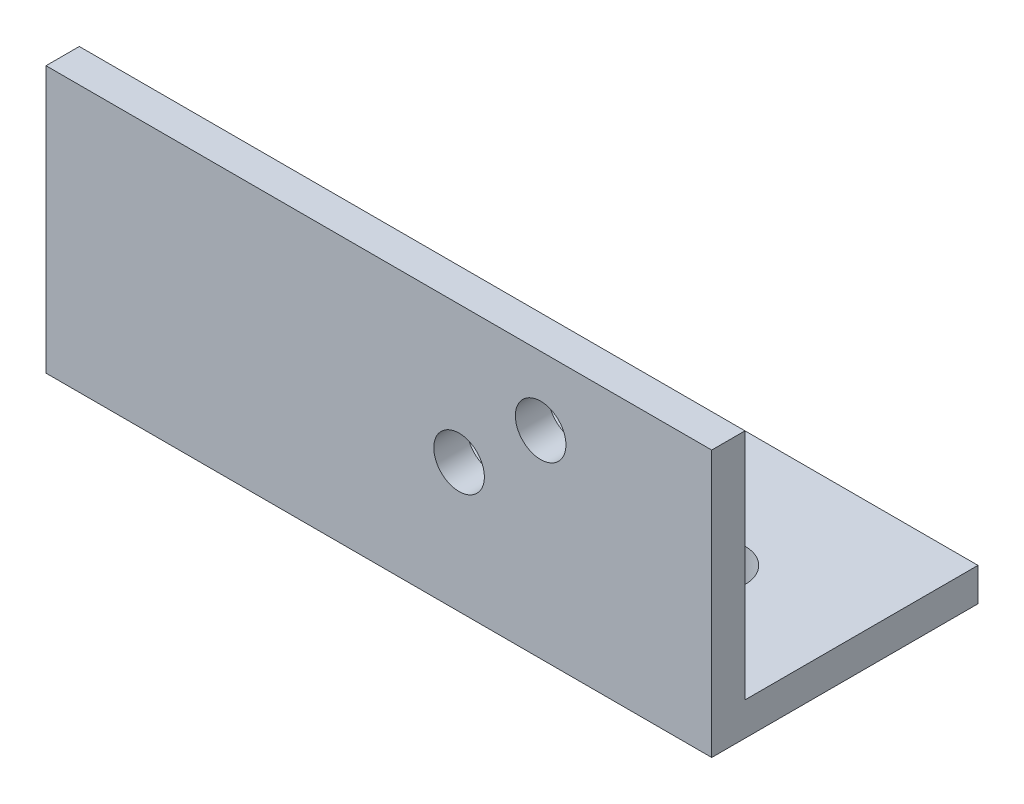
ISO-10303-21;
HEADER;
FILE_DESCRIPTION(('STEP AP214'),'2;1');
FILE_NAME('part.step','',(''),(''),'','','');
FILE_SCHEMA(('AUTOMOTIVE_DESIGN { 1 0 10303 214 1 1 1 1 }'));
ENDSEC;
DATA;
#1=APPLICATION_CONTEXT('core data for automotive mechanical design processes');
#2=APPLICATION_PROTOCOL_DEFINITION('international standard','automotive_design',2000,#1);
#3=PRODUCT_CONTEXT('',#1,'mechanical');
#4=PRODUCT('Part','Part','',(#3));
#5=PRODUCT_RELATED_PRODUCT_CATEGORY('part','',(#4));
#6=PRODUCT_DEFINITION_FORMATION('','',#4);
#7=PRODUCT_DEFINITION_CONTEXT('part definition',#1,'design');
#8=PRODUCT_DEFINITION('design','',#6,#7);
#9=PRODUCT_DEFINITION_SHAPE('','',#8);
#10=(LENGTH_UNIT() NAMED_UNIT(*) SI_UNIT(.MILLI.,.METRE.));
#11=(NAMED_UNIT(*) PLANE_ANGLE_UNIT() SI_UNIT($,.RADIAN.));
#12=(NAMED_UNIT(*) SI_UNIT($,.STERADIAN.) SOLID_ANGLE_UNIT());
#13=UNCERTAINTY_MEASURE_WITH_UNIT(LENGTH_MEASURE(1.E-05),#10,'distance_accuracy_value','');
#14=(GEOMETRIC_REPRESENTATION_CONTEXT(3) GLOBAL_UNCERTAINTY_ASSIGNED_CONTEXT((#13)) GLOBAL_UNIT_ASSIGNED_CONTEXT((#10,
#11,#12)) REPRESENTATION_CONTEXT('',''));
#15=CARTESIAN_POINT('',(0.,0.,0.));
#16=DIRECTION('',(0.,0.,1.));
#17=DIRECTION('',(1.,0.,0.));
#18=AXIS2_PLACEMENT_3D('',#15,#16,#17);
#19=CARTESIAN_POINT('',(0.,3.175,0.));
#20=DIRECTION('',(1.,0.,0.));
#21=DIRECTION('',(0.,0.,1.));
#22=AXIS2_PLACEMENT_3D('',#19,#20,#21);
#23=PLANE('',#22);
#24=DIRECTION('',(0.,0.,-1.));
#25=VECTOR('',#24,1.);
#26=CARTESIAN_POINT('',(0.,0.,0.));
#27=LINE('',#26,#25);
#28=CARTESIAN_POINT('',(0.,0.,0.));
#29=VERTEX_POINT('',#28);
#30=CARTESIAN_POINT('',(0.,0.,-25.4));
#31=VERTEX_POINT('',#30);
#32=EDGE_CURVE('E87',#29,#31,#27,.T.);
#33=ORIENTED_EDGE('',*,*,#32,.F.);
#34=DIRECTION('',(0.,-1.,0.));
#35=VECTOR('',#34,1.);
#36=CARTESIAN_POINT('',(0.,3.175,0.));
#37=LINE('',#36,#35);
#38=CARTESIAN_POINT('',(0.,25.4,0.));
#39=VERTEX_POINT('',#38);
#40=EDGE_CURVE('E96',#39,#29,#37,.T.);
#41=ORIENTED_EDGE('',*,*,#40,.F.);
#42=DIRECTION('',(0.,0.,-1.));
#43=VECTOR('',#42,1.);
#44=CARTESIAN_POINT('',(0.,25.4,0.));
#45=LINE('',#44,#43);
#46=CARTESIAN_POINT('',(0.,25.4,-3.175));
#47=VERTEX_POINT('',#46);
#48=EDGE_CURVE('E142',#39,#47,#45,.T.);
#49=ORIENTED_EDGE('',*,*,#48,.T.);
#50=DIRECTION('',(0.,-1.,0.));
#51=VECTOR('',#50,1.);
#52=CARTESIAN_POINT('',(0.,25.4,-3.175));
#53=LINE('',#52,#51);
#54=CARTESIAN_POINT('',(0.,3.175,-3.175));
#55=VERTEX_POINT('',#54);
#56=EDGE_CURVE('E108',#47,#55,#53,.T.);
#57=ORIENTED_EDGE('',*,*,#56,.T.);
#58=DIRECTION('',(0.,0.,-1.));
#59=VECTOR('',#58,1.);
#60=CARTESIAN_POINT('',(0.,3.175,0.));
#61=LINE('',#60,#59);
#62=CARTESIAN_POINT('',(0.,3.175,-25.4));
#63=VERTEX_POINT('',#62);
#64=EDGE_CURVE('E92',#55,#63,#61,.T.);
#65=ORIENTED_EDGE('',*,*,#64,.T.);
#66=DIRECTION('',(0.,-1.,0.));
#67=VECTOR('',#66,1.);
#68=CARTESIAN_POINT('',(0.,3.175,-25.4));
#69=LINE('',#68,#67);
#70=EDGE_CURVE('E11',#63,#31,#69,.T.);
#71=ORIENTED_EDGE('',*,*,#70,.T.);
#72=EDGE_LOOP('',(#33,#41,#49,#57,#65,#71));
#73=FACE_BOUND('',#72,.T.);
#74=ADVANCED_FACE('F41',(#73),#23,.F.);
#75=CARTESIAN_POINT('',(0.,3.175,-25.4));
#76=DIRECTION('',(0.,0.,1.));
#77=DIRECTION('',(-1.,0.,0.));
#78=AXIS2_PLACEMENT_3D('',#75,#76,#77);
#79=PLANE('',#78);
#80=DIRECTION('',(1.,0.,0.));
#81=VECTOR('',#80,1.);
#82=CARTESIAN_POINT('',(0.,0.,-25.4));
#83=LINE('',#82,#81);
#84=CARTESIAN_POINT('',(63.5,0.,-25.4));
#85=VERTEX_POINT('',#84);
#86=EDGE_CURVE('E107',#31,#85,#83,.T.);
#87=ORIENTED_EDGE('',*,*,#86,.F.);
#88=ORIENTED_EDGE('',*,*,#70,.F.);
#89=DIRECTION('',(1.,0.,0.));
#90=VECTOR('',#89,1.);
#91=CARTESIAN_POINT('',(0.,3.175,-25.4));
#92=LINE('',#91,#90);
#93=CARTESIAN_POINT('',(63.5,3.175,-25.4));
#94=VERTEX_POINT('',#93);
#95=EDGE_CURVE('E122',#63,#94,#92,.T.);
#96=ORIENTED_EDGE('',*,*,#95,.T.);
#97=DIRECTION('',(0.,-1.,0.));
#98=VECTOR('',#97,1.);
#99=CARTESIAN_POINT('',(63.5,3.175,-25.4));
#100=LINE('',#99,#98);
#101=EDGE_CURVE('E48',#94,#85,#100,.T.);
#102=ORIENTED_EDGE('',*,*,#101,.T.);
#103=EDGE_LOOP('',(#87,#88,#96,#102));
#104=FACE_BOUND('',#103,.T.);
#105=ADVANCED_FACE('F121',(#104),#79,.F.);
#106=CARTESIAN_POINT('',(63.5,3.175,0.));
#107=DIRECTION('',(-1.,0.,0.));
#108=DIRECTION('',(0.,0.,-1.));
#109=AXIS2_PLACEMENT_3D('',#106,#107,#108);
#110=PLANE('',#109);
#111=DIRECTION('',(0.,0.,1.));
#112=VECTOR('',#111,1.);
#113=CARTESIAN_POINT('',(63.5,0.,0.));
#114=LINE('',#113,#112);
#115=CARTESIAN_POINT('',(63.5,0.,0.));
#116=VERTEX_POINT('',#115);
#117=EDGE_CURVE('E88',#85,#116,#114,.T.);
#118=ORIENTED_EDGE('',*,*,#117,.F.);
#119=ORIENTED_EDGE('',*,*,#101,.F.);
#120=DIRECTION('',(0.,0.,1.));
#121=VECTOR('',#120,1.);
#122=CARTESIAN_POINT('',(63.5,3.175,0.));
#123=LINE('',#122,#121);
#124=CARTESIAN_POINT('',(63.5,3.175,-3.175));
#125=VERTEX_POINT('',#124);
#126=EDGE_CURVE('E63',#94,#125,#123,.T.);
#127=ORIENTED_EDGE('',*,*,#126,.T.);
#128=DIRECTION('',(0.,-1.,0.));
#129=VECTOR('',#128,1.);
#130=CARTESIAN_POINT('',(63.5,25.4,-3.175));
#131=LINE('',#130,#129);
#132=CARTESIAN_POINT('',(63.5,25.4,-3.175));
#133=VERTEX_POINT('',#132);
#134=EDGE_CURVE('E112',#133,#125,#131,.T.);
#135=ORIENTED_EDGE('',*,*,#134,.F.);
#136=DIRECTION('',(0.,0.,1.));
#137=VECTOR('',#136,1.);
#138=CARTESIAN_POINT('',(63.5,25.4,0.));
#139=LINE('',#138,#137);
#140=CARTESIAN_POINT('',(63.5,25.4,0.));
#141=VERTEX_POINT('',#140);
#142=EDGE_CURVE('E130',#133,#141,#139,.T.);
#143=ORIENTED_EDGE('',*,*,#142,.T.);
#144=DIRECTION('',(0.,-1.,0.));
#145=VECTOR('',#144,1.);
#146=CARTESIAN_POINT('',(63.5,3.175,0.));
#147=LINE('',#146,#145);
#148=EDGE_CURVE('E103',#141,#116,#147,.T.);
#149=ORIENTED_EDGE('',*,*,#148,.T.);
#150=EDGE_LOOP('',(#118,#119,#127,#135,#143,#149));
#151=FACE_BOUND('',#150,.T.);
#152=ADVANCED_FACE('F124',(#151),#110,.F.);
#153=CARTESIAN_POINT('',(0.,3.175,0.));
#154=DIRECTION('',(0.,0.,-1.));
#155=DIRECTION('',(1.,0.,0.));
#156=AXIS2_PLACEMENT_3D('',#153,#154,#155);
#157=PLANE('',#156);
#158=CARTESIAN_POINT('',(47.1846454612127,18.8692778855847,0.));
#159=DIRECTION('',(0.,0.,-1.));
#160=DIRECTION('',(-1.,0.,0.));
#161=AXIS2_PLACEMENT_3D('',#158,#159,#160);
#162=CIRCLE('',#161,2.413);
#163=CARTESIAN_POINT('',(44.7716454612127,18.8692778855847,0.));
#164=VERTEX_POINT('',#163);
#165=EDGE_CURVE('E246',#164,#164,#162,.T.);
#166=ORIENTED_EDGE('',*,*,#165,.T.);
#167=EDGE_LOOP('',(#166));
#168=FACE_BOUND('',#167,.T.);
#169=CARTESIAN_POINT('',(39.4016339191239,12.3385557711694,0.));
#170=DIRECTION('',(0.,0.,-1.));
#171=DIRECTION('',(-1.,0.,0.));
#172=AXIS2_PLACEMENT_3D('',#169,#170,#171);
#173=CIRCLE('',#172,2.41299999999999);
#174=CARTESIAN_POINT('',(36.9886339191239,12.3385557711694,0.));
#175=VERTEX_POINT('',#174);
#176=EDGE_CURVE('E251',#175,#175,#173,.T.);
#177=ORIENTED_EDGE('',*,*,#176,.T.);
#178=EDGE_LOOP('',(#177));
#179=FACE_BOUND('',#178,.T.);
#180=DIRECTION('',(-1.,0.,0.));
#181=VECTOR('',#180,1.);
#182=CARTESIAN_POINT('',(0.,0.,0.));
#183=LINE('',#182,#181);
#184=EDGE_CURVE('E82',#116,#29,#183,.T.);
#185=ORIENTED_EDGE('',*,*,#184,.F.);
#186=ORIENTED_EDGE('',*,*,#148,.F.);
#187=DIRECTION('',(-1.,0.,0.));
#188=VECTOR('',#187,1.);
#189=CARTESIAN_POINT('',(0.,25.4,0.));
#190=LINE('',#189,#188);
#191=EDGE_CURVE('E99',#141,#39,#190,.T.);
#192=ORIENTED_EDGE('',*,*,#191,.T.);
#193=ORIENTED_EDGE('',*,*,#40,.T.);
#194=EDGE_LOOP('',(#185,#186,#192,#193));
#195=FACE_BOUND('',#194,.T.);
#196=ADVANCED_FACE('F97',(#168,#179,#195),#157,.F.);
#197=CARTESIAN_POINT('',(0.,3.175,0.));
#198=DIRECTION('',(0.,1.,0.));
#199=DIRECTION('',(0.,0.,-1.));
#200=AXIS2_PLACEMENT_3D('',#197,#198,#199);
#201=PLANE('',#200);
#202=CARTESIAN_POINT('',(50.8,3.175,-12.7));
#203=DIRECTION('',(0.,-1.,0.));
#204=DIRECTION('',(0.,0.,-1.));
#205=AXIS2_PLACEMENT_3D('',#202,#203,#204);
#206=CIRCLE('',#205,3.175);
#207=CARTESIAN_POINT('',(50.8,3.175,-15.875));
#208=VERTEX_POINT('',#207);
#209=EDGE_CURVE('E258',#208,#208,#206,.T.);
#210=ORIENTED_EDGE('',*,*,#209,.T.);
#211=EDGE_LOOP('',(#210));
#212=FACE_BOUND('',#211,.T.);
#213=CARTESIAN_POINT('',(12.7,3.175,-12.7));
#214=DIRECTION('',(0.,-1.,0.));
#215=DIRECTION('',(0.,0.,-1.));
#216=AXIS2_PLACEMENT_3D('',#213,#214,#215);
#217=CIRCLE('',#216,3.175);
#218=CARTESIAN_POINT('',(12.7,3.175,-15.875));
#219=VERTEX_POINT('',#218);
#220=EDGE_CURVE('E149',#219,#219,#217,.T.);
#221=ORIENTED_EDGE('',*,*,#220,.T.);
#222=EDGE_LOOP('',(#221));
#223=FACE_BOUND('',#222,.T.);
#224=DIRECTION('',(1.,0.,0.));
#225=VECTOR('',#224,1.);
#226=CARTESIAN_POINT('',(0.,3.175,-3.175));
#227=LINE('',#226,#225);
#228=EDGE_CURVE('E55',#55,#125,#227,.T.);
#229=ORIENTED_EDGE('',*,*,#228,.T.);
#230=ORIENTED_EDGE('',*,*,#126,.F.);
#231=ORIENTED_EDGE('',*,*,#95,.F.);
#232=ORIENTED_EDGE('',*,*,#64,.F.);
#233=EDGE_LOOP('',(#229,#230,#231,#232));
#234=FACE_BOUND('',#233,.T.);
#235=ADVANCED_FACE('F155',(#212,#223,#234),#201,.T.);
#236=CARTESIAN_POINT('',(0.,0.,0.));
#237=DIRECTION('',(0.,1.,0.));
#238=DIRECTION('',(0.,0.,-1.));
#239=AXIS2_PLACEMENT_3D('',#236,#237,#238);
#240=PLANE('',#239);
#241=CARTESIAN_POINT('',(50.8,0.,-12.7));
#242=DIRECTION('',(0.,-1.,0.));
#243=DIRECTION('',(0.,0.,-1.));
#244=AXIS2_PLACEMENT_3D('',#241,#242,#243);
#245=CIRCLE('',#244,3.175);
#246=CARTESIAN_POINT('',(50.8,0.,-15.875));
#247=VERTEX_POINT('',#246);
#248=EDGE_CURVE('E146',#247,#247,#245,.T.);
#249=ORIENTED_EDGE('',*,*,#248,.F.);
#250=EDGE_LOOP('',(#249));
#251=FACE_BOUND('',#250,.T.);
#252=CARTESIAN_POINT('',(12.7,0.,-12.7));
#253=DIRECTION('',(0.,-1.,0.));
#254=DIRECTION('',(0.,0.,-1.));
#255=AXIS2_PLACEMENT_3D('',#252,#253,#254);
#256=CIRCLE('',#255,3.175);
#257=CARTESIAN_POINT('',(12.7,0.,-15.875));
#258=VERTEX_POINT('',#257);
#259=EDGE_CURVE('E259',#258,#258,#256,.T.);
#260=ORIENTED_EDGE('',*,*,#259,.F.);
#261=EDGE_LOOP('',(#260));
#262=FACE_BOUND('',#261,.T.);
#263=ORIENTED_EDGE('',*,*,#32,.T.);
#264=ORIENTED_EDGE('',*,*,#86,.T.);
#265=ORIENTED_EDGE('',*,*,#117,.T.);
#266=ORIENTED_EDGE('',*,*,#184,.T.);
#267=EDGE_LOOP('',(#263,#264,#265,#266));
#268=FACE_BOUND('',#267,.T.);
#269=ADVANCED_FACE('F84',(#251,#262,#268),#240,.F.);
#270=CARTESIAN_POINT('',(0.,25.4,-3.175));
#271=DIRECTION('',(0.,0.,1.));
#272=DIRECTION('',(-1.,0.,0.));
#273=AXIS2_PLACEMENT_3D('',#270,#271,#272);
#274=PLANE('',#273);
#275=CARTESIAN_POINT('',(47.1846454612127,18.8692778855847,-3.175));
#276=DIRECTION('',(0.,0.,-1.));
#277=DIRECTION('',(-1.,0.,0.));
#278=AXIS2_PLACEMENT_3D('',#275,#276,#277);
#279=CIRCLE('',#278,2.413);
#280=CARTESIAN_POINT('',(44.7716454612127,18.8692778855847,-3.175));
#281=VERTEX_POINT('',#280);
#282=EDGE_CURVE('E243',#281,#281,#279,.T.);
#283=ORIENTED_EDGE('',*,*,#282,.F.);
#284=EDGE_LOOP('',(#283));
#285=FACE_BOUND('',#284,.T.);
#286=CARTESIAN_POINT('',(39.4016339191239,12.3385557711694,-3.175));
#287=DIRECTION('',(0.,0.,-1.));
#288=DIRECTION('',(-1.,0.,0.));
#289=AXIS2_PLACEMENT_3D('',#286,#287,#288);
#290=CIRCLE('',#289,2.41299999999999);
#291=CARTESIAN_POINT('',(36.9886339191239,12.3385557711694,-3.175));
#292=VERTEX_POINT('',#291);
#293=EDGE_CURVE('E247',#292,#292,#290,.T.);
#294=ORIENTED_EDGE('',*,*,#293,.F.);
#295=EDGE_LOOP('',(#294));
#296=FACE_BOUND('',#295,.T.);
#297=ORIENTED_EDGE('',*,*,#228,.F.);
#298=ORIENTED_EDGE('',*,*,#56,.F.);
#299=DIRECTION('',(1.,0.,0.));
#300=VECTOR('',#299,1.);
#301=CARTESIAN_POINT('',(0.,25.4,-3.175));
#302=LINE('',#301,#300);
#303=EDGE_CURVE('E140',#47,#133,#302,.T.);
#304=ORIENTED_EDGE('',*,*,#303,.T.);
#305=ORIENTED_EDGE('',*,*,#134,.T.);
#306=EDGE_LOOP('',(#297,#298,#304,#305));
#307=FACE_BOUND('',#306,.T.);
#308=ADVANCED_FACE('F144',(#285,#296,#307),#274,.F.);
#309=CARTESIAN_POINT('',(0.,25.4,0.));
#310=DIRECTION('',(0.,1.,0.));
#311=DIRECTION('',(0.,0.,-1.));
#312=AXIS2_PLACEMENT_3D('',#309,#310,#311);
#313=PLANE('',#312);
#314=ORIENTED_EDGE('',*,*,#48,.F.);
#315=ORIENTED_EDGE('',*,*,#191,.F.);
#316=ORIENTED_EDGE('',*,*,#142,.F.);
#317=ORIENTED_EDGE('',*,*,#303,.F.);
#318=EDGE_LOOP('',(#314,#315,#316,#317));
#319=FACE_BOUND('',#318,.T.);
#320=ADVANCED_FACE('F141',(#319),#313,.T.);
#321=CARTESIAN_POINT('',(12.7,0.,-12.7));
#322=DIRECTION('',(0.,1.,0.));
#323=DIRECTION('',(0.,0.,-1.));
#324=AXIS2_PLACEMENT_3D('',#321,#322,#323);
#325=CYLINDRICAL_SURFACE('',#324,3.175);
#326=ORIENTED_EDGE('',*,*,#259,.T.);
#327=EDGE_LOOP('',(#326));
#328=FACE_BOUND('',#327,.T.);
#329=ORIENTED_EDGE('',*,*,#220,.F.);
#330=EDGE_LOOP('',(#329));
#331=FACE_BOUND('',#330,.T.);
#332=ADVANCED_FACE('F207',(#328,#331),#325,.F.);
#333=CARTESIAN_POINT('',(50.8,0.,-12.7));
#334=DIRECTION('',(0.,1.,0.));
#335=DIRECTION('',(0.,0.,-1.));
#336=AXIS2_PLACEMENT_3D('',#333,#334,#335);
#337=CYLINDRICAL_SURFACE('',#336,3.175);
#338=ORIENTED_EDGE('',*,*,#248,.T.);
#339=EDGE_LOOP('',(#338));
#340=FACE_BOUND('',#339,.T.);
#341=ORIENTED_EDGE('',*,*,#209,.F.);
#342=EDGE_LOOP('',(#341));
#343=FACE_BOUND('',#342,.T.);
#344=ADVANCED_FACE('F214',(#340,#343),#337,.F.);
#345=CARTESIAN_POINT('',(39.4016339191239,12.3385557711694,-3.175));
#346=DIRECTION('',(0.,0.,1.));
#347=DIRECTION('',(-1.,0.,0.));
#348=AXIS2_PLACEMENT_3D('',#345,#346,#347);
#349=CYLINDRICAL_SURFACE('',#348,2.41299999999999);
#350=ORIENTED_EDGE('',*,*,#293,.T.);
#351=EDGE_LOOP('',(#350));
#352=FACE_BOUND('',#351,.T.);
#353=ORIENTED_EDGE('',*,*,#176,.F.);
#354=EDGE_LOOP('',(#353));
#355=FACE_BOUND('',#354,.T.);
#356=ADVANCED_FACE('F222',(#352,#355),#349,.F.);
#357=CARTESIAN_POINT('',(47.1846454612127,18.8692778855847,-3.175));
#358=DIRECTION('',(0.,0.,1.));
#359=DIRECTION('',(-1.,0.,0.));
#360=AXIS2_PLACEMENT_3D('',#357,#358,#359);
#361=CYLINDRICAL_SURFACE('',#360,2.413);
#362=ORIENTED_EDGE('',*,*,#282,.T.);
#363=EDGE_LOOP('',(#362));
#364=FACE_BOUND('',#363,.T.);
#365=ORIENTED_EDGE('',*,*,#165,.F.);
#366=EDGE_LOOP('',(#365));
#367=FACE_BOUND('',#366,.T.);
#368=ADVANCED_FACE('F230',(#364,#367),#361,.F.);
#369=CLOSED_SHELL('',(#74,#105,#152,#196,#235,#269,#308,#320,#332,#344,#356,#368));
#370=MANIFOLD_SOLID_BREP('B2',#369);
#371=ADVANCED_BREP_SHAPE_REPRESENTATION('',(#18,#370),#14);
#372=SHAPE_DEFINITION_REPRESENTATION(#9,#371);
ENDSEC;
END-ISO-10303-21;
